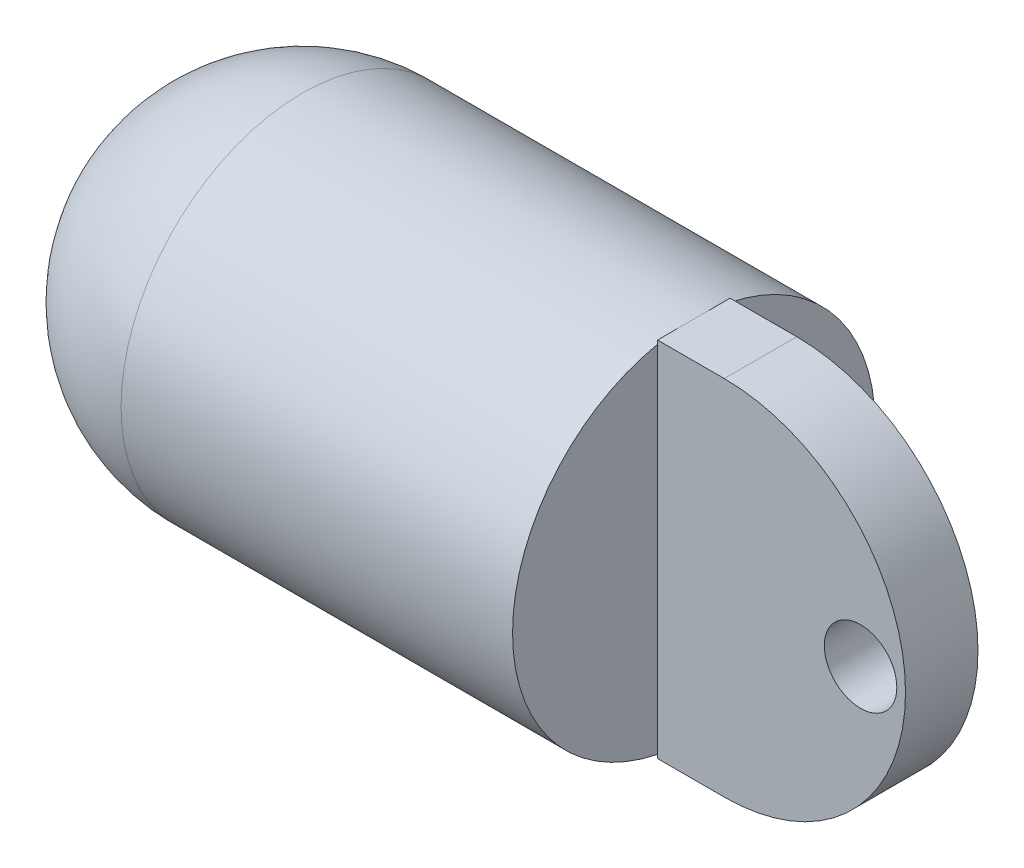
ISO-10303-21;
HEADER;
FILE_DESCRIPTION(('STEP AP214'),'2;1');
FILE_NAME('part.step','',(''),(''),'','','');
FILE_SCHEMA(('AUTOMOTIVE_DESIGN { 1 0 10303 214 1 1 1 1 }'));
ENDSEC;
DATA;
#1=APPLICATION_CONTEXT('core data for automotive mechanical design processes');
#2=APPLICATION_PROTOCOL_DEFINITION('international standard','automotive_design',2000,#1);
#3=PRODUCT_CONTEXT('',#1,'mechanical');
#4=PRODUCT('Part','Part','',(#3));
#5=PRODUCT_RELATED_PRODUCT_CATEGORY('part','',(#4));
#6=PRODUCT_DEFINITION_FORMATION('','',#4);
#7=PRODUCT_DEFINITION_CONTEXT('part definition',#1,'design');
#8=PRODUCT_DEFINITION('design','',#6,#7);
#9=PRODUCT_DEFINITION_SHAPE('','',#8);
#10=(LENGTH_UNIT() NAMED_UNIT(*) SI_UNIT(.MILLI.,.METRE.));
#11=(NAMED_UNIT(*) PLANE_ANGLE_UNIT() SI_UNIT($,.RADIAN.));
#12=(NAMED_UNIT(*) SI_UNIT($,.STERADIAN.) SOLID_ANGLE_UNIT());
#13=UNCERTAINTY_MEASURE_WITH_UNIT(LENGTH_MEASURE(1.E-05),#10,'distance_accuracy_value','');
#14=(GEOMETRIC_REPRESENTATION_CONTEXT(3) GLOBAL_UNCERTAINTY_ASSIGNED_CONTEXT((#13)) GLOBAL_UNIT_ASSIGNED_CONTEXT((#10,
#11,#12)) REPRESENTATION_CONTEXT('',''));
#15=CARTESIAN_POINT('',(0.,0.,0.));
#16=DIRECTION('',(0.,0.,1.));
#17=DIRECTION('',(1.,0.,0.));
#18=AXIS2_PLACEMENT_3D('',#15,#16,#17);
#19=CARTESIAN_POINT('',(0.,0.,0.));
#20=DIRECTION('',(1.,0.,0.));
#21=DIRECTION('',(0.,0.,-1.));
#22=AXIS2_PLACEMENT_3D('',#19,#20,#21);
#23=PLANE('',#22);
#24=DIRECTION('',(0.,1.,0.));
#25=VECTOR('',#24,1.);
#26=CARTESIAN_POINT('',(0.,12.5,-2.5));
#27=LINE('',#26,#25);
#28=CARTESIAN_POINT('',(0.,-12.2474487139159,-2.5));
#29=VERTEX_POINT('',#28);
#30=CARTESIAN_POINT('',(0.,12.2474487139159,-2.5));
#31=VERTEX_POINT('',#30);
#32=EDGE_CURVE('E11',#29,#31,#27,.T.);
#33=ORIENTED_EDGE('',*,*,#32,.F.);
#34=CARTESIAN_POINT('',(0.,0.,0.));
#35=DIRECTION('',(1.,0.,0.));
#36=DIRECTION('',(0.,0.,-1.));
#37=AXIS2_PLACEMENT_3D('',#34,#35,#36);
#38=CIRCLE('',#37,12.5);
#39=EDGE_CURVE('E165',#29,#31,#38,.T.);
#40=ORIENTED_EDGE('',*,*,#39,.T.);
#41=EDGE_LOOP('',(#33,#40));
#42=FACE_BOUND('',#41,.T.);
#43=ADVANCED_FACE('F39',(#42),#23,.T.);
#44=CARTESIAN_POINT('',(-27.,0.,0.));
#45=DIRECTION('',(1.,0.,0.));
#46=DIRECTION('',(0.,0.,-1.));
#47=AXIS2_PLACEMENT_3D('',#44,#45,#46);
#48=CYLINDRICAL_SURFACE('',#47,12.5);
#49=CARTESIAN_POINT('',(-27.,0.,0.));
#50=DIRECTION('',(1.,0.,0.));
#51=DIRECTION('',(0.,0.,-1.));
#52=AXIS2_PLACEMENT_3D('',#49,#50,#51);
#53=CIRCLE('',#52,12.5);
#54=CARTESIAN_POINT('',(-26.9999999999999,0.,-12.5));
#55=VERTEX_POINT('',#54);
#56=EDGE_CURVE('E243',#55,#55,#53,.T.);
#57=ORIENTED_EDGE('',*,*,#56,.T.);
#58=EDGE_LOOP('',(#57));
#59=FACE_BOUND('',#58,.T.);
#60=CARTESIAN_POINT('',(0.,12.5,0.));
#61=VERTEX_POINT('',#60);
#62=EDGE_CURVE('E166',#31,#61,#38,.T.);
#63=ORIENTED_EDGE('',*,*,#62,.F.);
#64=ORIENTED_EDGE('',*,*,#39,.F.);
#65=CARTESIAN_POINT('',(0.,-12.5,0.));
#66=VERTEX_POINT('',#65);
#67=EDGE_CURVE('E63',#66,#29,#38,.T.);
#68=ORIENTED_EDGE('',*,*,#67,.F.);
#69=CARTESIAN_POINT('',(0.,-12.2474487139159,2.5));
#70=VERTEX_POINT('',#69);
#71=EDGE_CURVE('E181',#70,#66,#38,.T.);
#72=ORIENTED_EDGE('',*,*,#71,.F.);
#73=CARTESIAN_POINT('',(0.,12.2474487139159,2.5));
#74=VERTEX_POINT('',#73);
#75=EDGE_CURVE('E178',#74,#70,#38,.T.);
#76=ORIENTED_EDGE('',*,*,#75,.F.);
#77=EDGE_CURVE('E169',#61,#74,#38,.T.);
#78=ORIENTED_EDGE('',*,*,#77,.F.);
#79=EDGE_LOOP('',(#63,#64,#68,#72,#76,#78));
#80=FACE_BOUND('',#79,.T.);
#81=ADVANCED_FACE('F41',(#59,#80),#48,.T.);
#82=DIRECTION('',(0.,-1.,0.));
#83=VECTOR('',#82,1.);
#84=CARTESIAN_POINT('',(0.,12.5,2.5));
#85=LINE('',#84,#83);
#86=EDGE_CURVE('E49',#74,#70,#85,.T.);
#87=ORIENTED_EDGE('',*,*,#86,.F.);
#88=ORIENTED_EDGE('',*,*,#75,.T.);
#89=EDGE_LOOP('',(#87,#88));
#90=FACE_BOUND('',#89,.T.);
#91=ADVANCED_FACE('F190',(#90),#23,.T.);
#92=CARTESIAN_POINT('',(0.,0.,0.));
#93=DIRECTION('',(-1.,0.,0.));
#94=DIRECTION('',(0.,0.,1.));
#95=AXIS2_PLACEMENT_3D('',#92,#93,#94);
#96=PLANE('',#95);
#97=CARTESIAN_POINT('',(0.,12.5,-2.5));
#98=VERTEX_POINT('',#97);
#99=EDGE_CURVE('E52',#31,#98,#27,.T.);
#100=ORIENTED_EDGE('',*,*,#99,.F.);
#101=ORIENTED_EDGE('',*,*,#62,.T.);
#102=DIRECTION('',(0.,0.,1.));
#103=VECTOR('',#102,1.);
#104=CARTESIAN_POINT('',(0.,12.5,2.5));
#105=LINE('',#104,#103);
#106=EDGE_CURVE('E146',#98,#61,#105,.T.);
#107=ORIENTED_EDGE('',*,*,#106,.F.);
#108=EDGE_LOOP('',(#100,#101,#107));
#109=FACE_BOUND('',#108,.T.);
#110=ADVANCED_FACE('F196',(#109),#96,.T.);
#111=CARTESIAN_POINT('',(0.,12.5,2.5));
#112=VERTEX_POINT('',#111);
#113=EDGE_CURVE('E139',#61,#112,#105,.T.);
#114=ORIENTED_EDGE('',*,*,#113,.F.);
#115=ORIENTED_EDGE('',*,*,#77,.T.);
#116=EDGE_CURVE('E150',#112,#74,#85,.T.);
#117=ORIENTED_EDGE('',*,*,#116,.F.);
#118=EDGE_LOOP('',(#114,#115,#117));
#119=FACE_BOUND('',#118,.T.);
#120=ADVANCED_FACE('F195',(#119),#96,.T.);
#121=CARTESIAN_POINT('',(0.,-12.5,2.5));
#122=VERTEX_POINT('',#121);
#123=EDGE_CURVE('E126',#70,#122,#85,.T.);
#124=ORIENTED_EDGE('',*,*,#123,.F.);
#125=ORIENTED_EDGE('',*,*,#71,.T.);
#126=DIRECTION('',(0.,0.,-1.));
#127=VECTOR('',#126,1.);
#128=CARTESIAN_POINT('',(0.,-12.5,2.5));
#129=LINE('',#128,#127);
#130=EDGE_CURVE('E154',#122,#66,#129,.T.);
#131=ORIENTED_EDGE('',*,*,#130,.F.);
#132=EDGE_LOOP('',(#124,#125,#131));
#133=FACE_BOUND('',#132,.T.);
#134=ADVANCED_FACE('F191',(#133),#96,.T.);
#135=CARTESIAN_POINT('',(4.6,12.5,2.5));
#136=DIRECTION('',(0.,-1.,0.));
#137=DIRECTION('',(0.,0.,-1.));
#138=AXIS2_PLACEMENT_3D('',#135,#136,#137);
#139=PLANE('',#138);
#140=ORIENTED_EDGE('',*,*,#106,.T.);
#141=ORIENTED_EDGE('',*,*,#113,.T.);
#142=DIRECTION('',(-1.,0.,0.));
#143=VECTOR('',#142,1.);
#144=CARTESIAN_POINT('',(4.6,12.5,2.5));
#145=LINE('',#144,#143);
#146=CARTESIAN_POINT('',(4.6,12.5,2.5));
#147=VERTEX_POINT('',#146);
#148=EDGE_CURVE('E128',#147,#112,#145,.T.);
#149=ORIENTED_EDGE('',*,*,#148,.F.);
#150=DIRECTION('',(0.,0.,1.));
#151=VECTOR('',#150,1.);
#152=CARTESIAN_POINT('',(4.6,12.5,2.5));
#153=LINE('',#152,#151);
#154=CARTESIAN_POINT('',(4.6,12.5,-2.5));
#155=VERTEX_POINT('',#154);
#156=EDGE_CURVE('E116',#155,#147,#153,.T.);
#157=ORIENTED_EDGE('',*,*,#156,.F.);
#158=DIRECTION('',(-1.,0.,0.));
#159=VECTOR('',#158,1.);
#160=CARTESIAN_POINT('',(4.6,12.5,-2.5));
#161=LINE('',#160,#159);
#162=EDGE_CURVE('E115',#155,#98,#161,.T.);
#163=ORIENTED_EDGE('',*,*,#162,.T.);
#164=EDGE_LOOP('',(#140,#141,#149,#157,#163));
#165=FACE_BOUND('',#164,.T.);
#166=ADVANCED_FACE('F204',(#165),#139,.F.);
#167=CARTESIAN_POINT('',(4.6,12.5,2.5));
#168=DIRECTION('',(0.,0.,-1.));
#169=DIRECTION('',(0.,1.,0.));
#170=AXIS2_PLACEMENT_3D('',#167,#168,#169);
#171=PLANE('',#170);
#172=CARTESIAN_POINT('',(14.,0.,2.5));
#173=DIRECTION('',(0.,0.,-1.));
#174=DIRECTION('',(0.,1.,0.));
#175=AXIS2_PLACEMENT_3D('',#172,#173,#174);
#176=CIRCLE('',#175,2.5);
#177=CARTESIAN_POINT('',(14.,2.5,2.5));
#178=VERTEX_POINT('',#177);
#179=EDGE_CURVE('E135',#178,#178,#176,.T.);
#180=ORIENTED_EDGE('',*,*,#179,.T.);
#181=EDGE_LOOP('',(#180));
#182=FACE_BOUND('',#181,.T.);
#183=ORIENTED_EDGE('',*,*,#116,.T.);
#184=ORIENTED_EDGE('',*,*,#86,.T.);
#185=ORIENTED_EDGE('',*,*,#123,.T.);
#186=DIRECTION('',(-1.,0.,0.));
#187=VECTOR('',#186,1.);
#188=CARTESIAN_POINT('',(4.6,-12.5,2.5));
#189=LINE('',#188,#187);
#190=CARTESIAN_POINT('',(4.6,-12.5,2.5));
#191=VERTEX_POINT('',#190);
#192=EDGE_CURVE('E106',#191,#122,#189,.T.);
#193=ORIENTED_EDGE('',*,*,#192,.F.);
#194=CARTESIAN_POINT('',(4.6,0.,2.5));
#195=DIRECTION('',(0.,0.,1.));
#196=DIRECTION('',(1.,0.,0.));
#197=AXIS2_PLACEMENT_3D('',#194,#195,#196);
#198=CIRCLE('',#197,12.5);
#199=EDGE_CURVE('E123',#191,#147,#198,.T.);
#200=ORIENTED_EDGE('',*,*,#199,.T.);
#201=ORIENTED_EDGE('',*,*,#148,.T.);
#202=EDGE_LOOP('',(#183,#184,#185,#193,#200,#201));
#203=FACE_BOUND('',#202,.T.);
#204=ADVANCED_FACE('F121',(#182,#203),#171,.F.);
#205=CARTESIAN_POINT('',(4.6,-12.5,2.5));
#206=DIRECTION('',(0.,1.,0.));
#207=DIRECTION('',(0.,0.,1.));
#208=AXIS2_PLACEMENT_3D('',#205,#206,#207);
#209=PLANE('',#208);
#210=ORIENTED_EDGE('',*,*,#130,.T.);
#211=CARTESIAN_POINT('',(0.,-12.5,-2.5));
#212=VERTEX_POINT('',#211);
#213=EDGE_CURVE('E153',#66,#212,#129,.T.);
#214=ORIENTED_EDGE('',*,*,#213,.T.);
#215=DIRECTION('',(-1.,0.,0.));
#216=VECTOR('',#215,1.);
#217=CARTESIAN_POINT('',(4.6,-12.5,-2.5));
#218=LINE('',#217,#216);
#219=CARTESIAN_POINT('',(4.6,-12.5,-2.5));
#220=VERTEX_POINT('',#219);
#221=EDGE_CURVE('E109',#220,#212,#218,.T.);
#222=ORIENTED_EDGE('',*,*,#221,.F.);
#223=DIRECTION('',(0.,0.,-1.));
#224=VECTOR('',#223,1.);
#225=CARTESIAN_POINT('',(4.6,-12.5,2.5));
#226=LINE('',#225,#224);
#227=EDGE_CURVE('E102',#191,#220,#226,.T.);
#228=ORIENTED_EDGE('',*,*,#227,.F.);
#229=ORIENTED_EDGE('',*,*,#192,.T.);
#230=EDGE_LOOP('',(#210,#214,#222,#228,#229));
#231=FACE_BOUND('',#230,.T.);
#232=ADVANCED_FACE('F105',(#231),#209,.F.);
#233=CARTESIAN_POINT('',(4.6,12.5,-2.5));
#234=DIRECTION('',(0.,0.,1.));
#235=DIRECTION('',(0.,-1.,0.));
#236=AXIS2_PLACEMENT_3D('',#233,#234,#235);
#237=PLANE('',#236);
#238=CARTESIAN_POINT('',(14.,0.,-2.5));
#239=DIRECTION('',(0.,0.,1.));
#240=DIRECTION('',(0.,-1.,0.));
#241=AXIS2_PLACEMENT_3D('',#238,#239,#240);
#242=CIRCLE('',#241,2.5);
#243=CARTESIAN_POINT('',(14.,-2.5,-2.5));
#244=VERTEX_POINT('',#243);
#245=EDGE_CURVE('E43',#244,#244,#242,.T.);
#246=ORIENTED_EDGE('',*,*,#245,.T.);
#247=EDGE_LOOP('',(#246));
#248=FACE_BOUND('',#247,.T.);
#249=EDGE_CURVE('E51',#212,#29,#27,.T.);
#250=ORIENTED_EDGE('',*,*,#249,.T.);
#251=ORIENTED_EDGE('',*,*,#32,.T.);
#252=ORIENTED_EDGE('',*,*,#99,.T.);
#253=ORIENTED_EDGE('',*,*,#162,.F.);
#254=CARTESIAN_POINT('',(4.6,0.,-2.5));
#255=DIRECTION('',(0.,0.,1.));
#256=DIRECTION('',(1.,0.,0.));
#257=AXIS2_PLACEMENT_3D('',#254,#255,#256);
#258=CIRCLE('',#257,12.5);
#259=EDGE_CURVE('E134',#220,#155,#258,.T.);
#260=ORIENTED_EDGE('',*,*,#259,.F.);
#261=ORIENTED_EDGE('',*,*,#221,.T.);
#262=EDGE_LOOP('',(#250,#251,#252,#253,#260,#261));
#263=FACE_BOUND('',#262,.T.);
#264=ADVANCED_FACE('F199',(#248,#263),#237,.F.);
#265=ORIENTED_EDGE('',*,*,#213,.F.);
#266=ORIENTED_EDGE('',*,*,#67,.T.);
#267=ORIENTED_EDGE('',*,*,#249,.F.);
#268=EDGE_LOOP('',(#265,#266,#267));
#269=FACE_BOUND('',#268,.T.);
#270=ADVANCED_FACE('F200',(#269),#96,.T.);
#271=CARTESIAN_POINT('',(4.6,0.,-2.5));
#272=DIRECTION('',(0.,0.,1.));
#273=DIRECTION('',(1.,0.,0.));
#274=AXIS2_PLACEMENT_3D('',#271,#272,#273);
#275=CYLINDRICAL_SURFACE('',#274,12.5);
#276=ORIENTED_EDGE('',*,*,#199,.F.);
#277=ORIENTED_EDGE('',*,*,#227,.T.);
#278=ORIENTED_EDGE('',*,*,#259,.T.);
#279=ORIENTED_EDGE('',*,*,#156,.T.);
#280=EDGE_LOOP('',(#276,#277,#278,#279));
#281=FACE_BOUND('',#280,.T.);
#282=ADVANCED_FACE('F131',(#281),#275,.T.);
#283=CARTESIAN_POINT('',(14.,0.,-12.5));
#284=DIRECTION('',(0.,0.,1.));
#285=DIRECTION('',(1.,0.,0.));
#286=AXIS2_PLACEMENT_3D('',#283,#284,#285);
#287=CYLINDRICAL_SURFACE('',#286,2.5);
#288=ORIENTED_EDGE('',*,*,#245,.F.);
#289=EDGE_LOOP('',(#288));
#290=FACE_BOUND('',#289,.T.);
#291=ORIENTED_EDGE('',*,*,#179,.F.);
#292=EDGE_LOOP('',(#291));
#293=FACE_BOUND('',#292,.T.);
#294=ADVANCED_FACE('F233',(#290,#293),#287,.F.);
#295=CARTESIAN_POINT('',(-27.,0.,0.));
#296=DIRECTION('',(0.,1.,0.));
#297=DIRECTION('',(0.,0.,-1.));
#298=AXIS2_PLACEMENT_3D('',#295,#296,#297);
#299=SPHERICAL_SURFACE('',#298,12.5);
#300=CARTESIAN_POINT('',(-27.,0.,0.));
#301=DIRECTION('',(1.,0.,0.));
#302=DIRECTION('',(0.,0.,-1.));
#303=AXIS2_PLACEMENT_3D('',#300,#301,#302);
#304=SPHERICAL_SURFACE('',#303,12.5);
#305=ORIENTED_EDGE('',*,*,#56,.F.);
#306=EDGE_LOOP('',(#305));
#307=FACE_BOUND('',#306,.T.);
#308=ADVANCED_FACE('F249',(#307),#304,.T.);
#309=CLOSED_SHELL('',(#43,#81,#91,#110,#120,#134,#166,#204,#232,#264,#270,#282,#294,#308));
#310=MANIFOLD_SOLID_BREP('B2',#309);
#311=ADVANCED_BREP_SHAPE_REPRESENTATION('',(#18,#310),#14);
#312=SHAPE_DEFINITION_REPRESENTATION(#9,#311);
ENDSEC;
END-ISO-10303-21;
